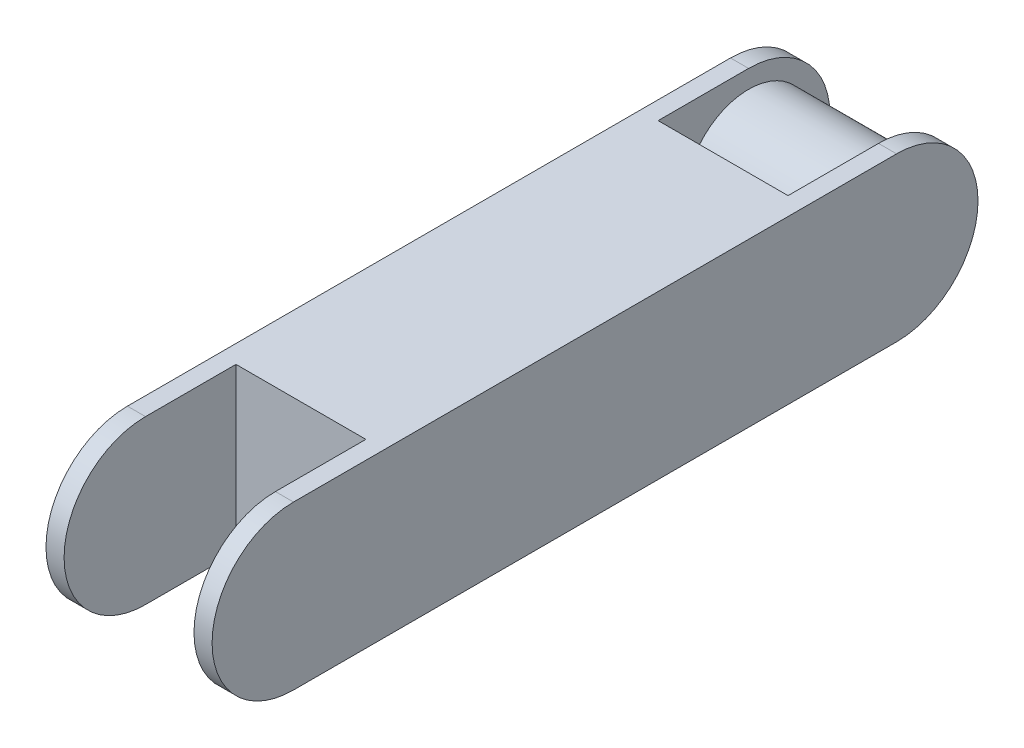
ISO-10303-21;
HEADER;
FILE_DESCRIPTION(('STEP AP214'),'2;1');
FILE_NAME('part.step','',(''),(''),'','','');
FILE_SCHEMA(('AUTOMOTIVE_DESIGN { 1 0 10303 214 1 1 1 1 }'));
ENDSEC;
DATA;
#1=APPLICATION_CONTEXT('core data for automotive mechanical design processes');
#2=APPLICATION_PROTOCOL_DEFINITION('international standard','automotive_design',2000,#1);
#3=PRODUCT_CONTEXT('',#1,'mechanical');
#4=PRODUCT('Part','Part','',(#3));
#5=PRODUCT_RELATED_PRODUCT_CATEGORY('part','',(#4));
#6=PRODUCT_DEFINITION_FORMATION('','',#4);
#7=PRODUCT_DEFINITION_CONTEXT('part definition',#1,'design');
#8=PRODUCT_DEFINITION('design','',#6,#7);
#9=PRODUCT_DEFINITION_SHAPE('','',#8);
#10=(LENGTH_UNIT() NAMED_UNIT(*) SI_UNIT(.MILLI.,.METRE.));
#11=(NAMED_UNIT(*) PLANE_ANGLE_UNIT() SI_UNIT($,.RADIAN.));
#12=(NAMED_UNIT(*) SI_UNIT($,.STERADIAN.) SOLID_ANGLE_UNIT());
#13=UNCERTAINTY_MEASURE_WITH_UNIT(LENGTH_MEASURE(1.E-05),#10,'distance_accuracy_value','');
#14=(GEOMETRIC_REPRESENTATION_CONTEXT(3) GLOBAL_UNCERTAINTY_ASSIGNED_CONTEXT((#13)) GLOBAL_UNIT_ASSIGNED_CONTEXT((#10,
#11,#12)) REPRESENTATION_CONTEXT('',''));
#15=CARTESIAN_POINT('',(0.,0.,0.));
#16=DIRECTION('',(0.,0.,1.));
#17=DIRECTION('',(1.,0.,0.));
#18=AXIS2_PLACEMENT_3D('',#15,#16,#17);
#19=CARTESIAN_POINT('',(10.77,0.,0.));
#20=DIRECTION('',(1.,0.,0.));
#21=DIRECTION('',(0.,0.,-1.));
#22=AXIS2_PLACEMENT_3D('',#19,#20,#21);
#23=PLANE('',#22);
#24=CARTESIAN_POINT('',(10.77,0.,0.));
#25=DIRECTION('',(1.,0.,0.));
#26=DIRECTION('',(0.,0.,-1.));
#27=AXIS2_PLACEMENT_3D('',#24,#25,#26);
#28=CIRCLE('',#27,10.5);
#29=CARTESIAN_POINT('',(10.77,0.,-10.5));
#30=VERTEX_POINT('',#29);
#31=EDGE_CURVE('E11',#30,#30,#28,.T.);
#32=ORIENTED_EDGE('',*,*,#31,.T.);
#33=EDGE_LOOP('',(#32));
#34=FACE_BOUND('',#33,.T.);
#35=DIRECTION('',(0.,0.,1.));
#36=VECTOR('',#35,1.);
#37=CARTESIAN_POINT('',(10.77,-13.5,0.));
#38=LINE('',#37,#36);
#39=CARTESIAN_POINT('',(10.77,-13.5,0.));
#40=VERTEX_POINT('',#39);
#41=CARTESIAN_POINT('',(10.77,-13.5,15.));
#42=VERTEX_POINT('',#41);
#43=EDGE_CURVE('E142',#40,#42,#38,.T.);
#44=ORIENTED_EDGE('',*,*,#43,.T.);
#45=DIRECTION('',(0.,1.,0.));
#46=VECTOR('',#45,1.);
#47=CARTESIAN_POINT('',(10.77,0.,15.));
#48=LINE('',#47,#46);
#49=CARTESIAN_POINT('',(10.77,13.5,15.));
#50=VERTEX_POINT('',#49);
#51=EDGE_CURVE('E56',#42,#50,#48,.T.);
#52=ORIENTED_EDGE('',*,*,#51,.T.);
#53=DIRECTION('',(0.,0.,-1.));
#54=VECTOR('',#53,1.);
#55=CARTESIAN_POINT('',(10.77,13.5,0.));
#56=LINE('',#55,#54);
#57=CARTESIAN_POINT('',(10.77,13.5,0.));
#58=VERTEX_POINT('',#57);
#59=EDGE_CURVE('E236',#50,#58,#56,.T.);
#60=ORIENTED_EDGE('',*,*,#59,.T.);
#61=CARTESIAN_POINT('',(10.77,0.,0.));
#62=DIRECTION('',(1.,0.,0.));
#63=DIRECTION('',(0.,0.,-1.));
#64=AXIS2_PLACEMENT_3D('',#61,#62,#63);
#65=CIRCLE('',#64,13.5);
#66=EDGE_CURVE('E232',#40,#58,#65,.T.);
#67=ORIENTED_EDGE('',*,*,#66,.F.);
#68=EDGE_LOOP('',(#44,#52,#60,#67));
#69=FACE_BOUND('',#68,.T.);
#70=ADVANCED_FACE('F39',(#34,#69),#23,.F.);
#71=CARTESIAN_POINT('',(-10.77,0.,0.));
#72=DIRECTION('',(-1.,0.,0.));
#73=DIRECTION('',(0.,0.,-1.));
#74=AXIS2_PLACEMENT_3D('',#71,#72,#73);
#75=PLANE('',#74);
#76=CARTESIAN_POINT('',(-10.77,0.,0.));
#77=DIRECTION('',(1.,0.,0.));
#78=DIRECTION('',(0.,0.,-1.));
#79=AXIS2_PLACEMENT_3D('',#76,#77,#78);
#80=CIRCLE('',#79,10.5);
#81=CARTESIAN_POINT('',(-10.77,0.,-10.5));
#82=VERTEX_POINT('',#81);
#83=EDGE_CURVE('E43',#82,#82,#80,.T.);
#84=ORIENTED_EDGE('',*,*,#83,.F.);
#85=EDGE_LOOP('',(#84));
#86=FACE_BOUND('',#85,.T.);
#87=DIRECTION('',(0.,0.,-1.));
#88=VECTOR('',#87,1.);
#89=CARTESIAN_POINT('',(-10.77,13.5,0.));
#90=LINE('',#89,#88);
#91=CARTESIAN_POINT('',(-10.77,13.5,15.));
#92=VERTEX_POINT('',#91);
#93=CARTESIAN_POINT('',(-10.77,13.5,0.));
#94=VERTEX_POINT('',#93);
#95=EDGE_CURVE('E183',#92,#94,#90,.T.);
#96=ORIENTED_EDGE('',*,*,#95,.F.);
#97=DIRECTION('',(0.,1.,0.));
#98=VECTOR('',#97,1.);
#99=CARTESIAN_POINT('',(-10.77,0.,15.));
#100=LINE('',#99,#98);
#101=CARTESIAN_POINT('',(-10.77,-13.5,15.));
#102=VERTEX_POINT('',#101);
#103=EDGE_CURVE('E166',#102,#92,#100,.T.);
#104=ORIENTED_EDGE('',*,*,#103,.F.);
#105=DIRECTION('',(0.,0.,1.));
#106=VECTOR('',#105,1.);
#107=CARTESIAN_POINT('',(-10.77,-13.5,0.));
#108=LINE('',#107,#106);
#109=CARTESIAN_POINT('',(-10.77,-13.5,0.));
#110=VERTEX_POINT('',#109);
#111=EDGE_CURVE('E175',#110,#102,#108,.T.);
#112=ORIENTED_EDGE('',*,*,#111,.F.);
#113=CARTESIAN_POINT('',(-10.77,0.,0.));
#114=DIRECTION('',(1.,0.,0.));
#115=DIRECTION('',(0.,0.,-1.));
#116=AXIS2_PLACEMENT_3D('',#113,#114,#115);
#117=CIRCLE('',#116,13.5);
#118=EDGE_CURVE('E170',#110,#94,#117,.T.);
#119=ORIENTED_EDGE('',*,*,#118,.T.);
#120=EDGE_LOOP('',(#96,#104,#112,#119));
#121=FACE_BOUND('',#120,.T.);
#122=ADVANCED_FACE('F278',(#86,#121),#75,.F.);
#123=CARTESIAN_POINT('',(10.77,0.,0.));
#124=DIRECTION('',(-1.,0.,0.));
#125=DIRECTION('',(0.,0.,1.));
#126=AXIS2_PLACEMENT_3D('',#123,#124,#125);
#127=CYLINDRICAL_SURFACE('',#126,10.5);
#128=ORIENTED_EDGE('',*,*,#31,.F.);
#129=EDGE_LOOP('',(#128));
#130=FACE_BOUND('',#129,.T.);
#131=ORIENTED_EDGE('',*,*,#83,.T.);
#132=EDGE_LOOP('',(#131));
#133=FACE_BOUND('',#132,.T.);
#134=ADVANCED_FACE('F41',(#130,#133),#127,.T.);
#135=CARTESIAN_POINT('',(13.77,0.,0.));
#136=DIRECTION('',(-1.,0.,0.));
#137=DIRECTION('',(0.,0.,1.));
#138=AXIS2_PLACEMENT_3D('',#135,#136,#137);
#139=CYLINDRICAL_SURFACE('',#138,13.5);
#140=ORIENTED_EDGE('',*,*,#66,.T.);
#141=DIRECTION('',(-1.,0.,0.));
#142=VECTOR('',#141,1.);
#143=CARTESIAN_POINT('',(13.77,13.5,0.));
#144=LINE('',#143,#142);
#145=CARTESIAN_POINT('',(13.77,13.5,0.));
#146=VERTEX_POINT('',#145);
#147=EDGE_CURVE('E49',#146,#58,#144,.T.);
#148=ORIENTED_EDGE('',*,*,#147,.F.);
#149=CARTESIAN_POINT('',(13.77,0.,0.));
#150=DIRECTION('',(1.,0.,0.));
#151=DIRECTION('',(0.,0.,-1.));
#152=AXIS2_PLACEMENT_3D('',#149,#150,#151);
#153=CIRCLE('',#152,13.5);
#154=CARTESIAN_POINT('',(13.77,-13.5,0.));
#155=VERTEX_POINT('',#154);
#156=EDGE_CURVE('E218',#155,#146,#153,.T.);
#157=ORIENTED_EDGE('',*,*,#156,.F.);
#158=DIRECTION('',(-1.,0.,0.));
#159=VECTOR('',#158,1.);
#160=CARTESIAN_POINT('',(13.77,-13.5,0.));
#161=LINE('',#160,#159);
#162=EDGE_CURVE('E231',#155,#40,#161,.T.);
#163=ORIENTED_EDGE('',*,*,#162,.T.);
#164=EDGE_LOOP('',(#140,#148,#157,#163));
#165=FACE_BOUND('',#164,.T.);
#166=ADVANCED_FACE('F260',(#165),#139,.T.);
#167=CARTESIAN_POINT('',(13.77,13.5,0.));
#168=DIRECTION('',(0.,1.,0.));
#169=DIRECTION('',(0.,0.,1.));
#170=AXIS2_PLACEMENT_3D('',#167,#168,#169);
#171=PLANE('',#170);
#172=CARTESIAN_POINT('',(10.77,13.5,100.));
#173=VERTEX_POINT('',#172);
#174=CARTESIAN_POINT('',(10.77,13.5,85.));
#175=VERTEX_POINT('',#174);
#176=EDGE_CURVE('E64',#173,#175,#56,.T.);
#177=ORIENTED_EDGE('',*,*,#176,.F.);
#178=DIRECTION('',(-1.,0.,0.));
#179=VECTOR('',#178,1.);
#180=CARTESIAN_POINT('',(13.77,13.5,100.));
#181=LINE('',#180,#179);
#182=CARTESIAN_POINT('',(13.77,13.5,100.));
#183=VERTEX_POINT('',#182);
#184=EDGE_CURVE('E246',#183,#173,#181,.T.);
#185=ORIENTED_EDGE('',*,*,#184,.F.);
#186=DIRECTION('',(0.,0.,-1.));
#187=VECTOR('',#186,1.);
#188=CARTESIAN_POINT('',(13.77,13.5,0.));
#189=LINE('',#188,#187);
#190=EDGE_CURVE('E221',#183,#146,#189,.T.);
#191=ORIENTED_EDGE('',*,*,#190,.T.);
#192=ORIENTED_EDGE('',*,*,#147,.T.);
#193=ORIENTED_EDGE('',*,*,#59,.F.);
#194=DIRECTION('',(1.,0.,0.));
#195=VECTOR('',#194,1.);
#196=CARTESIAN_POINT('',(-13.772,13.5,15.));
#197=LINE('',#196,#195);
#198=EDGE_CURVE('E159',#92,#50,#197,.T.);
#199=ORIENTED_EDGE('',*,*,#198,.F.);
#200=ORIENTED_EDGE('',*,*,#95,.T.);
#201=DIRECTION('',(1.,0.,0.));
#202=VECTOR('',#201,1.);
#203=CARTESIAN_POINT('',(-13.77,13.5,0.));
#204=LINE('',#203,#202);
#205=CARTESIAN_POINT('',(-13.77,13.5,0.));
#206=VERTEX_POINT('',#205);
#207=EDGE_CURVE('E214',#206,#94,#204,.T.);
#208=ORIENTED_EDGE('',*,*,#207,.F.);
#209=DIRECTION('',(0.,0.,-1.));
#210=VECTOR('',#209,1.);
#211=CARTESIAN_POINT('',(-13.77,13.5,0.));
#212=LINE('',#211,#210);
#213=CARTESIAN_POINT('',(-13.77,13.5,100.));
#214=VERTEX_POINT('',#213);
#215=EDGE_CURVE('E203',#214,#206,#212,.T.);
#216=ORIENTED_EDGE('',*,*,#215,.F.);
#217=DIRECTION('',(1.,0.,0.));
#218=VECTOR('',#217,1.);
#219=CARTESIAN_POINT('',(-13.77,13.5,100.));
#220=LINE('',#219,#218);
#221=CARTESIAN_POINT('',(-10.77,13.5,100.));
#222=VERTEX_POINT('',#221);
#223=EDGE_CURVE('E210',#214,#222,#220,.T.);
#224=ORIENTED_EDGE('',*,*,#223,.T.);
#225=CARTESIAN_POINT('',(-10.77,13.5,85.));
#226=VERTEX_POINT('',#225);
#227=EDGE_CURVE('E184',#222,#226,#90,.T.);
#228=ORIENTED_EDGE('',*,*,#227,.T.);
#229=DIRECTION('',(1.,0.,0.));
#230=VECTOR('',#229,1.);
#231=CARTESIAN_POINT('',(-13.772,13.5,85.));
#232=LINE('',#231,#230);
#233=EDGE_CURVE('E156',#226,#175,#232,.T.);
#234=ORIENTED_EDGE('',*,*,#233,.T.);
#235=EDGE_LOOP('',(#177,#185,#191,#192,#193,#199,#200,#208,#216,#224,#228,#234));
#236=FACE_BOUND('',#235,.T.);
#237=ADVANCED_FACE('F253',(#236),#171,.T.);
#238=CARTESIAN_POINT('',(13.77,0.,100.));
#239=DIRECTION('',(-1.,0.,0.));
#240=DIRECTION('',(0.,0.,1.));
#241=AXIS2_PLACEMENT_3D('',#238,#239,#240);
#242=CYLINDRICAL_SURFACE('',#241,13.5);
#243=CARTESIAN_POINT('',(10.77,0.,100.));
#244=DIRECTION('',(1.,0.,0.));
#245=DIRECTION('',(0.,0.,-1.));
#246=AXIS2_PLACEMENT_3D('',#243,#244,#245);
#247=CIRCLE('',#246,13.5);
#248=CARTESIAN_POINT('',(10.77,-13.5,100.));
#249=VERTEX_POINT('',#248);
#250=EDGE_CURVE('E143',#173,#249,#247,.T.);
#251=ORIENTED_EDGE('',*,*,#250,.T.);
#252=DIRECTION('',(-1.,0.,0.));
#253=VECTOR('',#252,1.);
#254=CARTESIAN_POINT('',(13.77,-13.5,100.));
#255=LINE('',#254,#253);
#256=CARTESIAN_POINT('',(13.77,-13.5,100.));
#257=VERTEX_POINT('',#256);
#258=EDGE_CURVE('E139',#257,#249,#255,.T.);
#259=ORIENTED_EDGE('',*,*,#258,.F.);
#260=CARTESIAN_POINT('',(13.77,0.,100.));
#261=DIRECTION('',(1.,0.,0.));
#262=DIRECTION('',(0.,0.,-1.));
#263=AXIS2_PLACEMENT_3D('',#260,#261,#262);
#264=CIRCLE('',#263,13.5);
#265=EDGE_CURVE('E225',#183,#257,#264,.T.);
#266=ORIENTED_EDGE('',*,*,#265,.F.);
#267=ORIENTED_EDGE('',*,*,#184,.T.);
#268=EDGE_LOOP('',(#251,#259,#266,#267));
#269=FACE_BOUND('',#268,.T.);
#270=ADVANCED_FACE('F326',(#269),#242,.T.);
#271=CARTESIAN_POINT('',(13.77,-13.5,0.));
#272=DIRECTION('',(0.,-1.,0.));
#273=DIRECTION('',(0.,0.,-1.));
#274=AXIS2_PLACEMENT_3D('',#271,#272,#273);
#275=PLANE('',#274);
#276=ORIENTED_EDGE('',*,*,#43,.F.);
#277=ORIENTED_EDGE('',*,*,#162,.F.);
#278=DIRECTION('',(0.,0.,1.));
#279=VECTOR('',#278,1.);
#280=CARTESIAN_POINT('',(13.77,-13.5,0.));
#281=LINE('',#280,#279);
#282=EDGE_CURVE('E228',#155,#257,#281,.T.);
#283=ORIENTED_EDGE('',*,*,#282,.T.);
#284=ORIENTED_EDGE('',*,*,#258,.T.);
#285=CARTESIAN_POINT('',(10.77,-13.5,85.));
#286=VERTEX_POINT('',#285);
#287=EDGE_CURVE('E131',#286,#249,#38,.T.);
#288=ORIENTED_EDGE('',*,*,#287,.F.);
#289=DIRECTION('',(1.,0.,0.));
#290=VECTOR('',#289,1.);
#291=CARTESIAN_POINT('',(-13.772,-13.5,85.));
#292=LINE('',#291,#290);
#293=CARTESIAN_POINT('',(-10.77,-13.5,85.));
#294=VERTEX_POINT('',#293);
#295=EDGE_CURVE('E135',#294,#286,#292,.T.);
#296=ORIENTED_EDGE('',*,*,#295,.F.);
#297=CARTESIAN_POINT('',(-10.77,-13.5,100.));
#298=VERTEX_POINT('',#297);
#299=EDGE_CURVE('E174',#294,#298,#108,.T.);
#300=ORIENTED_EDGE('',*,*,#299,.T.);
#301=DIRECTION('',(1.,0.,0.));
#302=VECTOR('',#301,1.);
#303=CARTESIAN_POINT('',(-13.77,-13.5,100.));
#304=LINE('',#303,#302);
#305=CARTESIAN_POINT('',(-13.77,-13.5,100.));
#306=VERTEX_POINT('',#305);
#307=EDGE_CURVE('E195',#306,#298,#304,.T.);
#308=ORIENTED_EDGE('',*,*,#307,.F.);
#309=DIRECTION('',(0.,0.,1.));
#310=VECTOR('',#309,1.);
#311=CARTESIAN_POINT('',(-13.77,-13.5,0.));
#312=LINE('',#311,#310);
#313=CARTESIAN_POINT('',(-13.77,-13.5,0.));
#314=VERTEX_POINT('',#313);
#315=EDGE_CURVE('E192',#314,#306,#312,.T.);
#316=ORIENTED_EDGE('',*,*,#315,.F.);
#317=DIRECTION('',(1.,0.,0.));
#318=VECTOR('',#317,1.);
#319=CARTESIAN_POINT('',(-13.77,-13.5,0.));
#320=LINE('',#319,#318);
#321=EDGE_CURVE('E188',#314,#110,#320,.T.);
#322=ORIENTED_EDGE('',*,*,#321,.T.);
#323=ORIENTED_EDGE('',*,*,#111,.T.);
#324=DIRECTION('',(1.,0.,0.));
#325=VECTOR('',#324,1.);
#326=CARTESIAN_POINT('',(-13.772,-13.5,15.));
#327=LINE('',#326,#325);
#328=EDGE_CURVE('E167',#102,#42,#327,.T.);
#329=ORIENTED_EDGE('',*,*,#328,.T.);
#330=EDGE_LOOP('',(#276,#277,#283,#284,#288,#296,#300,#308,#316,#322,#323,#329));
#331=FACE_BOUND('',#330,.T.);
#332=ADVANCED_FACE('F133',(#331),#275,.T.);
#333=CARTESIAN_POINT('',(13.77,0.,0.));
#334=DIRECTION('',(1.,0.,0.));
#335=DIRECTION('',(0.,0.,-1.));
#336=AXIS2_PLACEMENT_3D('',#333,#334,#335);
#337=PLANE('',#336);
#338=ORIENTED_EDGE('',*,*,#156,.T.);
#339=ORIENTED_EDGE('',*,*,#190,.F.);
#340=ORIENTED_EDGE('',*,*,#265,.T.);
#341=ORIENTED_EDGE('',*,*,#282,.F.);
#342=EDGE_LOOP('',(#338,#339,#340,#341));
#343=FACE_BOUND('',#342,.T.);
#344=ADVANCED_FACE('F315',(#343),#337,.T.);
#345=ORIENTED_EDGE('',*,*,#176,.T.);
#346=DIRECTION('',(0.,-1.,0.));
#347=VECTOR('',#346,1.);
#348=CARTESIAN_POINT('',(10.77,0.,85.));
#349=LINE('',#348,#347);
#350=EDGE_CURVE('E146',#175,#286,#349,.T.);
#351=ORIENTED_EDGE('',*,*,#350,.T.);
#352=ORIENTED_EDGE('',*,*,#287,.T.);
#353=ORIENTED_EDGE('',*,*,#250,.F.);
#354=EDGE_LOOP('',(#345,#351,#352,#353));
#355=FACE_BOUND('',#354,.T.);
#356=ADVANCED_FACE('F147',(#355),#23,.F.);
#357=CARTESIAN_POINT('',(-13.77,0.,0.));
#358=DIRECTION('',(1.,0.,0.));
#359=DIRECTION('',(0.,0.,1.));
#360=AXIS2_PLACEMENT_3D('',#357,#358,#359);
#361=CYLINDRICAL_SURFACE('',#360,13.5);
#362=ORIENTED_EDGE('',*,*,#118,.F.);
#363=ORIENTED_EDGE('',*,*,#321,.F.);
#364=CARTESIAN_POINT('',(-13.77,0.,0.));
#365=DIRECTION('',(1.,0.,0.));
#366=DIRECTION('',(0.,0.,-1.));
#367=AXIS2_PLACEMENT_3D('',#364,#365,#366);
#368=CIRCLE('',#367,13.5);
#369=EDGE_CURVE('E199',#314,#206,#368,.T.);
#370=ORIENTED_EDGE('',*,*,#369,.T.);
#371=ORIENTED_EDGE('',*,*,#207,.T.);
#372=EDGE_LOOP('',(#362,#363,#370,#371));
#373=FACE_BOUND('',#372,.T.);
#374=ADVANCED_FACE('F287',(#373),#361,.T.);
#375=CARTESIAN_POINT('',(-13.77,0.,100.));
#376=DIRECTION('',(1.,0.,0.));
#377=DIRECTION('',(0.,0.,1.));
#378=AXIS2_PLACEMENT_3D('',#375,#376,#377);
#379=CYLINDRICAL_SURFACE('',#378,13.5);
#380=CARTESIAN_POINT('',(-10.77,0.,100.));
#381=DIRECTION('',(1.,0.,0.));
#382=DIRECTION('',(0.,0.,-1.));
#383=AXIS2_PLACEMENT_3D('',#380,#381,#382);
#384=CIRCLE('',#383,13.5);
#385=EDGE_CURVE('E179',#222,#298,#384,.T.);
#386=ORIENTED_EDGE('',*,*,#385,.F.);
#387=ORIENTED_EDGE('',*,*,#223,.F.);
#388=CARTESIAN_POINT('',(-13.77,0.,100.));
#389=DIRECTION('',(1.,0.,0.));
#390=DIRECTION('',(0.,0.,-1.));
#391=AXIS2_PLACEMENT_3D('',#388,#389,#390);
#392=CIRCLE('',#391,13.5);
#393=EDGE_CURVE('E206',#214,#306,#392,.T.);
#394=ORIENTED_EDGE('',*,*,#393,.T.);
#395=ORIENTED_EDGE('',*,*,#307,.T.);
#396=EDGE_LOOP('',(#386,#387,#394,#395));
#397=FACE_BOUND('',#396,.T.);
#398=ADVANCED_FACE('F297',(#397),#379,.T.);
#399=CARTESIAN_POINT('',(-13.77,0.,0.));
#400=DIRECTION('',(-1.,0.,0.));
#401=DIRECTION('',(0.,0.,-1.));
#402=AXIS2_PLACEMENT_3D('',#399,#400,#401);
#403=PLANE('',#402);
#404=ORIENTED_EDGE('',*,*,#369,.F.);
#405=ORIENTED_EDGE('',*,*,#315,.T.);
#406=ORIENTED_EDGE('',*,*,#393,.F.);
#407=ORIENTED_EDGE('',*,*,#215,.T.);
#408=EDGE_LOOP('',(#404,#405,#406,#407));
#409=FACE_BOUND('',#408,.T.);
#410=ADVANCED_FACE('F291',(#409),#403,.T.);
#411=ORIENTED_EDGE('',*,*,#299,.F.);
#412=DIRECTION('',(0.,-1.,0.));
#413=VECTOR('',#412,1.);
#414=CARTESIAN_POINT('',(-10.77,0.,85.));
#415=LINE('',#414,#413);
#416=EDGE_CURVE('E153',#226,#294,#415,.T.);
#417=ORIENTED_EDGE('',*,*,#416,.F.);
#418=ORIENTED_EDGE('',*,*,#227,.F.);
#419=ORIENTED_EDGE('',*,*,#385,.T.);
#420=EDGE_LOOP('',(#411,#417,#418,#419));
#421=FACE_BOUND('',#420,.T.);
#422=ADVANCED_FACE('F282',(#421),#75,.F.);
#423=CARTESIAN_POINT('',(-13.772,0.,15.));
#424=DIRECTION('',(0.,0.,-1.));
#425=DIRECTION('',(-1.,0.,0.));
#426=AXIS2_PLACEMENT_3D('',#423,#424,#425);
#427=PLANE('',#426);
#428=ORIENTED_EDGE('',*,*,#328,.F.);
#429=ORIENTED_EDGE('',*,*,#103,.T.);
#430=ORIENTED_EDGE('',*,*,#198,.T.);
#431=ORIENTED_EDGE('',*,*,#51,.F.);
#432=EDGE_LOOP('',(#428,#429,#430,#431));
#433=FACE_BOUND('',#432,.T.);
#434=ADVANCED_FACE('F265',(#433),#427,.T.);
#435=CARTESIAN_POINT('',(-13.772,0.,85.));
#436=DIRECTION('',(0.,0.,1.));
#437=DIRECTION('',(1.,0.,0.));
#438=AXIS2_PLACEMENT_3D('',#435,#436,#437);
#439=PLANE('',#438);
#440=ORIENTED_EDGE('',*,*,#233,.F.);
#441=ORIENTED_EDGE('',*,*,#416,.T.);
#442=ORIENTED_EDGE('',*,*,#295,.T.);
#443=ORIENTED_EDGE('',*,*,#350,.F.);
#444=EDGE_LOOP('',(#440,#441,#442,#443));
#445=FACE_BOUND('',#444,.T.);
#446=ADVANCED_FACE('F151',(#445),#439,.T.);
#447=CLOSED_SHELL('',(#70,#122,#134,#166,#237,#270,#332,#344,#356,#374,#398,#410,#422,#434,#446));
#448=MANIFOLD_SOLID_BREP('B2',#447);
#449=ADVANCED_BREP_SHAPE_REPRESENTATION('',(#18,#448),#14);
#450=SHAPE_DEFINITION_REPRESENTATION(#9,#449);
ENDSEC;
END-ISO-10303-21;
